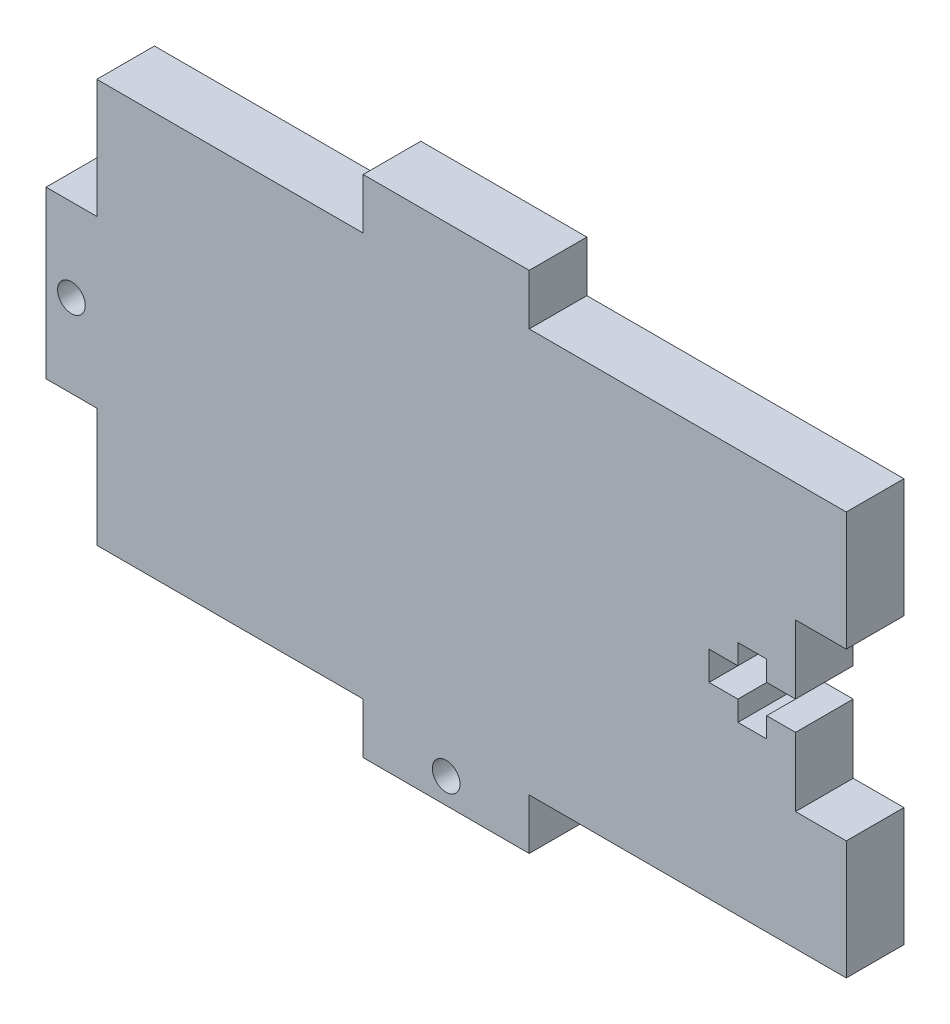
ISO-10303-21;
HEADER;
FILE_DESCRIPTION(('STEP AP214'),'2;1');
FILE_NAME('part.step','',(''),(''),'','','');
FILE_SCHEMA(('AUTOMOTIVE_DESIGN { 1 0 10303 214 1 1 1 1 }'));
ENDSEC;
DATA;
#1=APPLICATION_CONTEXT('core data for automotive mechanical design processes');
#2=APPLICATION_PROTOCOL_DEFINITION('international standard','automotive_design',2000,#1);
#3=PRODUCT_CONTEXT('',#1,'mechanical');
#4=PRODUCT('Part','Part','',(#3));
#5=PRODUCT_RELATED_PRODUCT_CATEGORY('part','',(#4));
#6=PRODUCT_DEFINITION_FORMATION('','',#4);
#7=PRODUCT_DEFINITION_CONTEXT('part definition',#1,'design');
#8=PRODUCT_DEFINITION('design','',#6,#7);
#9=PRODUCT_DEFINITION_SHAPE('','',#8);
#10=(LENGTH_UNIT() NAMED_UNIT(*) SI_UNIT(.MILLI.,.METRE.));
#11=(NAMED_UNIT(*) PLANE_ANGLE_UNIT() SI_UNIT($,.RADIAN.));
#12=(NAMED_UNIT(*) SI_UNIT($,.STERADIAN.) SOLID_ANGLE_UNIT());
#13=UNCERTAINTY_MEASURE_WITH_UNIT(LENGTH_MEASURE(1.E-05),#10,'distance_accuracy_value','');
#14=(GEOMETRIC_REPRESENTATION_CONTEXT(3) GLOBAL_UNCERTAINTY_ASSIGNED_CONTEXT((#13)) GLOBAL_UNIT_ASSIGNED_CONTEXT((#10,
#11,#12)) REPRESENTATION_CONTEXT('',''));
#15=CARTESIAN_POINT('',(0.,0.,0.));
#16=DIRECTION('',(0.,0.,1.));
#17=DIRECTION('',(1.,0.,0.));
#18=AXIS2_PLACEMENT_3D('',#15,#16,#17);
#19=CARTESIAN_POINT('',(76.962,13.081,-4.99999999997031E-05));
#20=DIRECTION('',(-1.,0.,0.));
#21=DIRECTION('',(0.,0.,1.));
#22=AXIS2_PLACEMENT_3D('',#19,#20,#21);
#23=PLANE('',#22);
#24=DIRECTION('',(0.,1.,0.));
#25=VECTOR('',#24,1.);
#26=CARTESIAN_POINT('',(76.962,0.,0.));
#27=LINE('',#26,#25);
#28=CARTESIAN_POINT('',(76.962,13.081,0.));
#29=VERTEX_POINT('',#28);
#30=CARTESIAN_POINT('',(76.962,20.6375,0.));
#31=VERTEX_POINT('',#30);
#32=EDGE_CURVE('E263',#29,#31,#27,.T.);
#33=ORIENTED_EDGE('',*,*,#32,.T.);
#34=DIRECTION('',(0.,0.,1.));
#35=VECTOR('',#34,1.);
#36=CARTESIAN_POINT('',(76.962,20.6375,-4.99999999997031E-05));
#37=LINE('',#36,#35);
#38=CARTESIAN_POINT('',(76.962,20.6375,6.35));
#39=VERTEX_POINT('',#38);
#40=EDGE_CURVE('E246',#31,#39,#37,.T.);
#41=ORIENTED_EDGE('',*,*,#40,.T.);
#42=DIRECTION('',(0.,-1.,0.));
#43=VECTOR('',#42,1.);
#44=CARTESIAN_POINT('',(76.962,13.081,6.35));
#45=LINE('',#44,#43);
#46=CARTESIAN_POINT('',(76.962,13.081,6.35));
#47=VERTEX_POINT('',#46);
#48=EDGE_CURVE('E260',#39,#47,#45,.T.);
#49=ORIENTED_EDGE('',*,*,#48,.T.);
#50=DIRECTION('',(0.,0.,1.));
#51=VECTOR('',#50,1.);
#52=CARTESIAN_POINT('',(76.962,13.081,-4.99999999997031E-05));
#53=LINE('',#52,#51);
#54=EDGE_CURVE('E286',#29,#47,#53,.T.);
#55=ORIENTED_EDGE('',*,*,#54,.F.);
#56=EDGE_LOOP('',(#33,#41,#49,#55));
#57=FACE_BOUND('',#56,.T.);
#58=ADVANCED_FACE('F33',(#57),#23,.F.);
#59=CARTESIAN_POINT('',(82.55,0.,6.35));
#60=DIRECTION('',(-1.,0.,0.));
#61=DIRECTION('',(0.,-1.,0.));
#62=AXIS2_PLACEMENT_3D('',#59,#60,#61);
#63=PLANE('',#62);
#64=DIRECTION('',(0.,1.,0.));
#65=VECTOR('',#64,1.);
#66=CARTESIAN_POINT('',(82.55,0.,0.));
#67=LINE('',#66,#65);
#68=CARTESIAN_POINT('',(82.55,0.,0.));
#69=VERTEX_POINT('',#68);
#70=CARTESIAN_POINT('',(82.55,13.081,0.));
#71=VERTEX_POINT('',#70);
#72=EDGE_CURVE('E487',#69,#71,#67,.T.);
#73=ORIENTED_EDGE('',*,*,#72,.T.);
#74=DIRECTION('',(0.,0.,1.));
#75=VECTOR('',#74,1.);
#76=CARTESIAN_POINT('',(82.55,13.081,-4.99999999997031E-05));
#77=LINE('',#76,#75);
#78=CARTESIAN_POINT('',(82.55,13.081,6.35));
#79=VERTEX_POINT('',#78);
#80=EDGE_CURVE('E282',#71,#79,#77,.T.);
#81=ORIENTED_EDGE('',*,*,#80,.T.);
#82=DIRECTION('',(0.,1.,0.));
#83=VECTOR('',#82,1.);
#84=CARTESIAN_POINT('',(82.55,0.,6.35));
#85=LINE('',#84,#83);
#86=CARTESIAN_POINT('',(82.55,0.,6.35));
#87=VERTEX_POINT('',#86);
#88=EDGE_CURVE('E461',#87,#79,#85,.T.);
#89=ORIENTED_EDGE('',*,*,#88,.F.);
#90=DIRECTION('',(0.,0.,-1.));
#91=VECTOR('',#90,1.);
#92=CARTESIAN_POINT('',(82.55,0.,6.35));
#93=LINE('',#92,#91);
#94=EDGE_CURVE('E496',#87,#69,#93,.T.);
#95=ORIENTED_EDGE('',*,*,#94,.T.);
#96=EDGE_LOOP('',(#73,#81,#89,#95));
#97=FACE_BOUND('',#96,.T.);
#98=ADVANCED_FACE('F676',(#97),#63,.F.);
#99=CARTESIAN_POINT('',(0.,0.,6.35));
#100=DIRECTION('',(0.,1.,0.));
#101=DIRECTION('',(0.,0.,1.));
#102=AXIS2_PLACEMENT_3D('',#99,#100,#101);
#103=PLANE('',#102);
#104=DIRECTION('',(0.,0.,1.));
#105=VECTOR('',#104,1.);
#106=CARTESIAN_POINT('',(47.625,0.,0.));
#107=LINE('',#106,#105);
#108=CARTESIAN_POINT('',(47.625,0.,0.));
#109=VERTEX_POINT('',#108);
#110=CARTESIAN_POINT('',(47.625,0.,6.35));
#111=VERTEX_POINT('',#110);
#112=EDGE_CURVE('E305',#109,#111,#107,.T.);
#113=ORIENTED_EDGE('',*,*,#112,.F.);
#114=DIRECTION('',(1.,0.,0.));
#115=VECTOR('',#114,1.);
#116=CARTESIAN_POINT('',(0.,0.,0.));
#117=LINE('',#116,#115);
#118=EDGE_CURVE('E504',#109,#69,#117,.T.);
#119=ORIENTED_EDGE('',*,*,#118,.T.);
#120=ORIENTED_EDGE('',*,*,#94,.F.);
#121=DIRECTION('',(1.,0.,0.));
#122=VECTOR('',#121,1.);
#123=CARTESIAN_POINT('',(0.,0.,6.35));
#124=LINE('',#123,#122);
#125=EDGE_CURVE('E466',#111,#87,#124,.T.);
#126=ORIENTED_EDGE('',*,*,#125,.F.);
#127=EDGE_LOOP('',(#113,#119,#120,#126));
#128=FACE_BOUND('',#127,.T.);
#129=ADVANCED_FACE('F657',(#128),#103,.F.);
#130=CARTESIAN_POINT('',(0.,44.45,6.35));
#131=DIRECTION('',(0.,-1.,0.));
#132=DIRECTION('',(0.,0.,-1.));
#133=AXIS2_PLACEMENT_3D('',#130,#131,#132);
#134=PLANE('',#133);
#135=DIRECTION('',(0.,0.,1.));
#136=VECTOR('',#135,1.);
#137=CARTESIAN_POINT('',(29.337,44.45,0.));
#138=LINE('',#137,#136);
#139=CARTESIAN_POINT('',(29.337,44.45,0.));
#140=VERTEX_POINT('',#139);
#141=CARTESIAN_POINT('',(29.337,44.45,6.35));
#142=VERTEX_POINT('',#141);
#143=EDGE_CURVE('E576',#140,#142,#138,.T.);
#144=ORIENTED_EDGE('',*,*,#143,.F.);
#145=DIRECTION('',(-1.,0.,0.));
#146=VECTOR('',#145,1.);
#147=CARTESIAN_POINT('',(0.,44.45,0.));
#148=LINE('',#147,#146);
#149=CARTESIAN_POINT('',(0.,44.45,0.));
#150=VERTEX_POINT('',#149);
#151=EDGE_CURVE('E483',#140,#150,#148,.T.);
#152=ORIENTED_EDGE('',*,*,#151,.T.);
#153=DIRECTION('',(0.,0.,-1.));
#154=VECTOR('',#153,1.);
#155=CARTESIAN_POINT('',(0.,44.45,6.35));
#156=LINE('',#155,#154);
#157=CARTESIAN_POINT('',(0.,44.45,6.35));
#158=VERTEX_POINT('',#157);
#159=EDGE_CURVE('E482',#158,#150,#156,.T.);
#160=ORIENTED_EDGE('',*,*,#159,.F.);
#161=DIRECTION('',(-1.,0.,0.));
#162=VECTOR('',#161,1.);
#163=CARTESIAN_POINT('',(0.,44.45,6.35));
#164=LINE('',#163,#162);
#165=EDGE_CURVE('E464',#142,#158,#164,.T.);
#166=ORIENTED_EDGE('',*,*,#165,.F.);
#167=EDGE_LOOP('',(#144,#152,#160,#166));
#168=FACE_BOUND('',#167,.T.);
#169=ADVANCED_FACE('F623',(#168),#134,.F.);
#170=CARTESIAN_POINT('',(0.,0.,6.35));
#171=DIRECTION('',(1.,0.,0.));
#172=DIRECTION('',(0.,1.,0.));
#173=AXIS2_PLACEMENT_3D('',#170,#171,#172);
#174=PLANE('',#173);
#175=DIRECTION('',(0.,0.,1.));
#176=VECTOR('',#175,1.);
#177=CARTESIAN_POINT('',(0.,13.081,0.));
#178=LINE('',#177,#176);
#179=CARTESIAN_POINT('',(0.,13.081,0.));
#180=VERTEX_POINT('',#179);
#181=CARTESIAN_POINT('',(0.,13.081,6.35));
#182=VERTEX_POINT('',#181);
#183=EDGE_CURVE('E507',#180,#182,#178,.T.);
#184=ORIENTED_EDGE('',*,*,#183,.F.);
#185=DIRECTION('',(0.,-1.,0.));
#186=VECTOR('',#185,1.);
#187=CARTESIAN_POINT('',(0.,0.,0.));
#188=LINE('',#187,#186);
#189=CARTESIAN_POINT('',(0.,0.,0.));
#190=VERTEX_POINT('',#189);
#191=EDGE_CURVE('E505',#180,#190,#188,.T.);
#192=ORIENTED_EDGE('',*,*,#191,.T.);
#193=DIRECTION('',(0.,0.,-1.));
#194=VECTOR('',#193,1.);
#195=CARTESIAN_POINT('',(0.,0.,6.35));
#196=LINE('',#195,#194);
#197=CARTESIAN_POINT('',(0.,0.,6.35));
#198=VERTEX_POINT('',#197);
#199=EDGE_CURVE('E321',#198,#190,#196,.T.);
#200=ORIENTED_EDGE('',*,*,#199,.F.);
#201=DIRECTION('',(0.,-1.,0.));
#202=VECTOR('',#201,1.);
#203=CARTESIAN_POINT('',(0.,0.,6.35));
#204=LINE('',#203,#202);
#205=EDGE_CURVE('E511',#182,#198,#204,.T.);
#206=ORIENTED_EDGE('',*,*,#205,.F.);
#207=EDGE_LOOP('',(#184,#192,#200,#206));
#208=FACE_BOUND('',#207,.T.);
#209=ADVANCED_FACE('F638',(#208),#174,.F.);
#210=CARTESIAN_POINT('',(0.,31.369,0.));
#211=VERTEX_POINT('',#210);
#212=EDGE_CURVE('E501',#150,#211,#188,.T.);
#213=ORIENTED_EDGE('',*,*,#212,.T.);
#214=DIRECTION('',(0.,0.,1.));
#215=VECTOR('',#214,1.);
#216=CARTESIAN_POINT('',(0.,31.369,0.));
#217=LINE('',#216,#215);
#218=CARTESIAN_POINT('',(0.,31.369,6.35));
#219=VERTEX_POINT('',#218);
#220=EDGE_CURVE('E521',#211,#219,#217,.T.);
#221=ORIENTED_EDGE('',*,*,#220,.T.);
#222=EDGE_CURVE('E508',#158,#219,#204,.T.);
#223=ORIENTED_EDGE('',*,*,#222,.F.);
#224=ORIENTED_EDGE('',*,*,#159,.T.);
#225=EDGE_LOOP('',(#213,#221,#223,#224));
#226=FACE_BOUND('',#225,.T.);
#227=ADVANCED_FACE('F35',(#226),#174,.F.);
#228=CARTESIAN_POINT('',(29.3369999999999,0.,0.));
#229=VERTEX_POINT('',#228);
#230=EDGE_CURVE('E594',#190,#229,#117,.T.);
#231=ORIENTED_EDGE('',*,*,#230,.T.);
#232=DIRECTION('',(0.,0.,1.));
#233=VECTOR('',#232,1.);
#234=CARTESIAN_POINT('',(29.3369999999999,0.,0.));
#235=LINE('',#234,#233);
#236=CARTESIAN_POINT('',(29.3369999999999,0.,6.35));
#237=VERTEX_POINT('',#236);
#238=EDGE_CURVE('E312',#229,#237,#235,.T.);
#239=ORIENTED_EDGE('',*,*,#238,.T.);
#240=EDGE_CURVE('E462',#198,#237,#124,.T.);
#241=ORIENTED_EDGE('',*,*,#240,.F.);
#242=ORIENTED_EDGE('',*,*,#199,.T.);
#243=EDGE_LOOP('',(#231,#239,#241,#242));
#244=FACE_BOUND('',#243,.T.);
#245=ADVANCED_FACE('F637',(#244),#103,.F.);
#246=CARTESIAN_POINT('',(82.55,31.369,6.35));
#247=VERTEX_POINT('',#246);
#248=CARTESIAN_POINT('',(82.55,44.45,6.35));
#249=VERTEX_POINT('',#248);
#250=EDGE_CURVE('E453',#247,#249,#85,.T.);
#251=ORIENTED_EDGE('',*,*,#250,.F.);
#252=DIRECTION('',(0.,0.,1.));
#253=VECTOR('',#252,1.);
#254=CARTESIAN_POINT('',(82.55,31.369,-4.99999999997031E-05));
#255=LINE('',#254,#253);
#256=CARTESIAN_POINT('',(82.55,31.369,0.));
#257=VERTEX_POINT('',#256);
#258=EDGE_CURVE('E281',#257,#247,#255,.T.);
#259=ORIENTED_EDGE('',*,*,#258,.F.);
#260=CARTESIAN_POINT('',(82.55,44.45,0.));
#261=VERTEX_POINT('',#260);
#262=EDGE_CURVE('E597',#257,#261,#67,.T.);
#263=ORIENTED_EDGE('',*,*,#262,.T.);
#264=DIRECTION('',(0.,0.,-1.));
#265=VECTOR('',#264,1.);
#266=CARTESIAN_POINT('',(82.55,44.45,6.35));
#267=LINE('',#266,#265);
#268=EDGE_CURVE('E459',#249,#261,#267,.T.);
#269=ORIENTED_EDGE('',*,*,#268,.F.);
#270=EDGE_LOOP('',(#251,#259,#263,#269));
#271=FACE_BOUND('',#270,.T.);
#272=ADVANCED_FACE('F456',(#271),#63,.F.);
#273=CARTESIAN_POINT('',(47.625,44.45,0.));
#274=VERTEX_POINT('',#273);
#275=EDGE_CURVE('E486',#261,#274,#148,.T.);
#276=ORIENTED_EDGE('',*,*,#275,.T.);
#277=DIRECTION('',(0.,0.,1.));
#278=VECTOR('',#277,1.);
#279=CARTESIAN_POINT('',(47.625,44.45,0.));
#280=LINE('',#279,#278);
#281=CARTESIAN_POINT('',(47.625,44.45,6.35));
#282=VERTEX_POINT('',#281);
#283=EDGE_CURVE('E563',#274,#282,#280,.T.);
#284=ORIENTED_EDGE('',*,*,#283,.T.);
#285=EDGE_CURVE('E480',#249,#282,#164,.T.);
#286=ORIENTED_EDGE('',*,*,#285,.F.);
#287=ORIENTED_EDGE('',*,*,#268,.T.);
#288=EDGE_LOOP('',(#276,#284,#286,#287));
#289=FACE_BOUND('',#288,.T.);
#290=ADVANCED_FACE('F630',(#289),#134,.F.);
#291=CARTESIAN_POINT('',(0.,0.,6.35));
#292=DIRECTION('',(0.,0.,-1.));
#293=DIRECTION('',(-1.,0.,0.));
#294=AXIS2_PLACEMENT_3D('',#291,#292,#293);
#295=PLANE('',#294);
#296=CARTESIAN_POINT('',(38.481,-2.79399999999999,6.35));
#297=DIRECTION('',(0.,0.,1.));
#298=DIRECTION('',(1.,0.,0.));
#299=AXIS2_PLACEMENT_3D('',#296,#297,#298);
#300=CIRCLE('',#299,1.524);
#301=CARTESIAN_POINT('',(40.005,-2.79399999999999,6.35));
#302=VERTEX_POINT('',#301);
#303=EDGE_CURVE('E348',#302,#302,#300,.T.);
#304=ORIENTED_EDGE('',*,*,#303,.F.);
#305=EDGE_LOOP('',(#304));
#306=FACE_BOUND('',#305,.T.);
#307=CARTESIAN_POINT('',(-2.794,22.225,6.35));
#308=DIRECTION('',(0.,0.,1.));
#309=DIRECTION('',(1.,0.,0.));
#310=AXIS2_PLACEMENT_3D('',#307,#308,#309);
#311=CIRCLE('',#310,1.524);
#312=CARTESIAN_POINT('',(-1.27,22.225,6.35));
#313=VERTEX_POINT('',#312);
#314=EDGE_CURVE('E340',#313,#313,#311,.T.);
#315=ORIENTED_EDGE('',*,*,#314,.F.);
#316=EDGE_LOOP('',(#315));
#317=FACE_BOUND('',#316,.T.);
#318=ORIENTED_EDGE('',*,*,#48,.F.);
#319=DIRECTION('',(1.,0.,0.));
#320=VECTOR('',#319,1.);
#321=CARTESIAN_POINT('',(73.787,20.6375,6.35));
#322=LINE('',#321,#320);
#323=CARTESIAN_POINT('',(73.787,20.6375,6.35));
#324=VERTEX_POINT('',#323);
#325=EDGE_CURVE('E243',#324,#39,#322,.T.);
#326=ORIENTED_EDGE('',*,*,#325,.F.);
#327=DIRECTION('',(0.,1.,0.));
#328=VECTOR('',#327,1.);
#329=CARTESIAN_POINT('',(73.787,18.415,6.35));
#330=LINE('',#329,#328);
#331=CARTESIAN_POINT('',(73.787,18.415,6.35));
#332=VERTEX_POINT('',#331);
#333=EDGE_CURVE('E377',#332,#324,#330,.T.);
#334=ORIENTED_EDGE('',*,*,#333,.F.);
#335=DIRECTION('',(1.,0.,0.));
#336=VECTOR('',#335,1.);
#337=CARTESIAN_POINT('',(70.612,18.415,6.35));
#338=LINE('',#337,#336);
#339=CARTESIAN_POINT('',(70.612,18.415,6.35));
#340=VERTEX_POINT('',#339);
#341=EDGE_CURVE('E374',#340,#332,#338,.T.);
#342=ORIENTED_EDGE('',*,*,#341,.F.);
#343=DIRECTION('',(0.,-1.,0.));
#344=VECTOR('',#343,1.);
#345=CARTESIAN_POINT('',(70.612,18.415,6.35));
#346=LINE('',#345,#344);
#347=CARTESIAN_POINT('',(70.612,20.6375,6.35));
#348=VERTEX_POINT('',#347);
#349=EDGE_CURVE('E371',#348,#340,#346,.T.);
#350=ORIENTED_EDGE('',*,*,#349,.F.);
#351=DIRECTION('',(1.,0.,0.));
#352=VECTOR('',#351,1.);
#353=CARTESIAN_POINT('',(67.437,20.6375,6.35));
#354=LINE('',#353,#352);
#355=CARTESIAN_POINT('',(67.437,20.6375,6.35));
#356=VERTEX_POINT('',#355);
#357=EDGE_CURVE('E368',#356,#348,#354,.T.);
#358=ORIENTED_EDGE('',*,*,#357,.F.);
#359=DIRECTION('',(0.,-1.,0.));
#360=VECTOR('',#359,1.);
#361=CARTESIAN_POINT('',(67.437,23.8125,6.35));
#362=LINE('',#361,#360);
#363=CARTESIAN_POINT('',(67.437,23.8125,6.35));
#364=VERTEX_POINT('',#363);
#365=EDGE_CURVE('E365',#364,#356,#362,.T.);
#366=ORIENTED_EDGE('',*,*,#365,.F.);
#367=DIRECTION('',(-1.,0.,0.));
#368=VECTOR('',#367,1.);
#369=CARTESIAN_POINT('',(67.437,23.8125,6.35));
#370=LINE('',#369,#368);
#371=CARTESIAN_POINT('',(70.612,23.8125,6.35));
#372=VERTEX_POINT('',#371);
#373=EDGE_CURVE('E362',#372,#364,#370,.T.);
#374=ORIENTED_EDGE('',*,*,#373,.F.);
#375=DIRECTION('',(0.,-1.,0.));
#376=VECTOR('',#375,1.);
#377=CARTESIAN_POINT('',(70.612,23.8125,6.35));
#378=LINE('',#377,#376);
#379=CARTESIAN_POINT('',(70.612,26.035,6.35));
#380=VERTEX_POINT('',#379);
#381=EDGE_CURVE('E359',#380,#372,#378,.T.);
#382=ORIENTED_EDGE('',*,*,#381,.F.);
#383=DIRECTION('',(-1.,0.,0.));
#384=VECTOR('',#383,1.);
#385=CARTESIAN_POINT('',(70.612,26.035,6.35));
#386=LINE('',#385,#384);
#387=CARTESIAN_POINT('',(73.787,26.035,6.35));
#388=VERTEX_POINT('',#387);
#389=EDGE_CURVE('E356',#388,#380,#386,.T.);
#390=ORIENTED_EDGE('',*,*,#389,.F.);
#391=DIRECTION('',(0.,1.,0.));
#392=VECTOR('',#391,1.);
#393=CARTESIAN_POINT('',(73.787,23.8125,6.35));
#394=LINE('',#393,#392);
#395=CARTESIAN_POINT('',(73.787,23.8125,6.35));
#396=VERTEX_POINT('',#395);
#397=EDGE_CURVE('E353',#396,#388,#394,.T.);
#398=ORIENTED_EDGE('',*,*,#397,.F.);
#399=DIRECTION('',(-1.,0.,0.));
#400=VECTOR('',#399,1.);
#401=CARTESIAN_POINT('',(73.787,23.8125,6.35));
#402=LINE('',#401,#400);
#403=CARTESIAN_POINT('',(76.962,23.8125,6.35));
#404=VERTEX_POINT('',#403);
#405=EDGE_CURVE('E254',#404,#396,#402,.T.);
#406=ORIENTED_EDGE('',*,*,#405,.F.);
#407=CARTESIAN_POINT('',(76.962,31.369,6.35));
#408=VERTEX_POINT('',#407);
#409=EDGE_CURVE('E271',#408,#404,#45,.T.);
#410=ORIENTED_EDGE('',*,*,#409,.F.);
#411=DIRECTION('',(-1.,0.,0.));
#412=VECTOR('',#411,1.);
#413=CARTESIAN_POINT('',(82.55,31.369,6.35));
#414=LINE('',#413,#412);
#415=EDGE_CURVE('E272',#247,#408,#414,.T.);
#416=ORIENTED_EDGE('',*,*,#415,.F.);
#417=ORIENTED_EDGE('',*,*,#250,.T.);
#418=ORIENTED_EDGE('',*,*,#285,.T.);
#419=DIRECTION('',(0.,1.,0.));
#420=VECTOR('',#419,1.);
#421=CARTESIAN_POINT('',(47.625,44.45,6.35));
#422=LINE('',#421,#420);
#423=CARTESIAN_POINT('',(47.625,50.038,6.35));
#424=VERTEX_POINT('',#423);
#425=EDGE_CURVE('E591',#282,#424,#422,.T.);
#426=ORIENTED_EDGE('',*,*,#425,.T.);
#427=DIRECTION('',(-1.,0.,0.));
#428=VECTOR('',#427,1.);
#429=CARTESIAN_POINT('',(29.337,50.038,6.35));
#430=LINE('',#429,#428);
#431=CARTESIAN_POINT('',(29.337,50.038,6.35));
#432=VERTEX_POINT('',#431);
#433=EDGE_CURVE('E566',#424,#432,#430,.T.);
#434=ORIENTED_EDGE('',*,*,#433,.T.);
#435=DIRECTION('',(0.,-1.,0.));
#436=VECTOR('',#435,1.);
#437=CARTESIAN_POINT('',(29.337,44.45,6.35));
#438=LINE('',#437,#436);
#439=EDGE_CURVE('E308',#432,#142,#438,.T.);
#440=ORIENTED_EDGE('',*,*,#439,.T.);
#441=ORIENTED_EDGE('',*,*,#165,.T.);
#442=ORIENTED_EDGE('',*,*,#222,.T.);
#443=DIRECTION('',(-1.,0.,0.));
#444=VECTOR('',#443,1.);
#445=CARTESIAN_POINT('',(0.,31.369,6.35));
#446=LINE('',#445,#444);
#447=CARTESIAN_POINT('',(-5.588,31.369,6.35));
#448=VERTEX_POINT('',#447);
#449=EDGE_CURVE('E549',#219,#448,#446,.T.);
#450=ORIENTED_EDGE('',*,*,#449,.T.);
#451=DIRECTION('',(0.,-1.,0.));
#452=VECTOR('',#451,1.);
#453=CARTESIAN_POINT('',(-5.588,31.369,6.35));
#454=LINE('',#453,#452);
#455=CARTESIAN_POINT('',(-5.588,13.081,6.35));
#456=VERTEX_POINT('',#455);
#457=EDGE_CURVE('E540',#448,#456,#454,.T.);
#458=ORIENTED_EDGE('',*,*,#457,.T.);
#459=DIRECTION('',(1.,0.,0.));
#460=VECTOR('',#459,1.);
#461=CARTESIAN_POINT('',(0.,13.081,6.35));
#462=LINE('',#461,#460);
#463=EDGE_CURVE('E531',#456,#182,#462,.T.);
#464=ORIENTED_EDGE('',*,*,#463,.T.);
#465=ORIENTED_EDGE('',*,*,#205,.T.);
#466=ORIENTED_EDGE('',*,*,#240,.T.);
#467=DIRECTION('',(0.,-1.,0.));
#468=VECTOR('',#467,1.);
#469=CARTESIAN_POINT('',(29.3369999999999,0.,6.35));
#470=LINE('',#469,#468);
#471=CARTESIAN_POINT('',(29.337,-5.588,6.35));
#472=VERTEX_POINT('',#471);
#473=EDGE_CURVE('E285',#237,#472,#470,.T.);
#474=ORIENTED_EDGE('',*,*,#473,.T.);
#475=DIRECTION('',(1.,0.,0.));
#476=VECTOR('',#475,1.);
#477=CARTESIAN_POINT('',(29.337,-5.588,6.35));
#478=LINE('',#477,#476);
#479=CARTESIAN_POINT('',(47.6249999999999,-5.588,6.35));
#480=VERTEX_POINT('',#479);
#481=EDGE_CURVE('E296',#472,#480,#478,.T.);
#482=ORIENTED_EDGE('',*,*,#481,.T.);
#483=DIRECTION('',(0.,1.,0.));
#484=VECTOR('',#483,1.);
#485=CARTESIAN_POINT('',(47.625,0.,6.35));
#486=LINE('',#485,#484);
#487=EDGE_CURVE('E299',#480,#111,#486,.T.);
#488=ORIENTED_EDGE('',*,*,#487,.T.);
#489=ORIENTED_EDGE('',*,*,#125,.T.);
#490=ORIENTED_EDGE('',*,*,#88,.T.);
#491=DIRECTION('',(1.,0.,0.));
#492=VECTOR('',#491,1.);
#493=CARTESIAN_POINT('',(82.55,13.081,6.35));
#494=LINE('',#493,#492);
#495=EDGE_CURVE('E270',#47,#79,#494,.T.);
#496=ORIENTED_EDGE('',*,*,#495,.F.);
#497=EDGE_LOOP('',(#318,#326,#334,#342,#350,#358,#366,#374,#382,#390,#398,#406,#410,#416,#417,
#418,#426,#434,#440,#441,#442,#450,#458,#464,#465,#466,#474,#482,#488,#489,#490,#496));
#498=FACE_BOUND('',#497,.T.);
#499=ADVANCED_FACE('F268',(#306,#317,#498),#295,.F.);
#500=CARTESIAN_POINT('',(0.,0.,0.));
#501=DIRECTION('',(0.,0.,-1.));
#502=DIRECTION('',(-1.,0.,0.));
#503=AXIS2_PLACEMENT_3D('',#500,#501,#502);
#504=PLANE('',#503);
#505=CARTESIAN_POINT('',(38.481,-2.79399999999999,0.));
#506=DIRECTION('',(0.,0.,-1.));
#507=DIRECTION('',(-1.,0.,0.));
#508=AXIS2_PLACEMENT_3D('',#505,#506,#507);
#509=CIRCLE('',#508,1.524);
#510=CARTESIAN_POINT('',(36.957,-2.79399999999999,0.));
#511=VERTEX_POINT('',#510);
#512=EDGE_CURVE('E37',#511,#511,#509,.T.);
#513=ORIENTED_EDGE('',*,*,#512,.F.);
#514=EDGE_LOOP('',(#513));
#515=FACE_BOUND('',#514,.T.);
#516=CARTESIAN_POINT('',(-2.794,22.225,0.));
#517=DIRECTION('',(0.,0.,-1.));
#518=DIRECTION('',(-1.,0.,0.));
#519=AXIS2_PLACEMENT_3D('',#516,#517,#518);
#520=CIRCLE('',#519,1.524);
#521=CARTESIAN_POINT('',(-4.318,22.225,0.));
#522=VERTEX_POINT('',#521);
#523=EDGE_CURVE('E255',#522,#522,#520,.T.);
#524=ORIENTED_EDGE('',*,*,#523,.F.);
#525=EDGE_LOOP('',(#524));
#526=FACE_BOUND('',#525,.T.);
#527=DIRECTION('',(-1.,0.,0.));
#528=VECTOR('',#527,1.);
#529=CARTESIAN_POINT('',(0.,20.6375,0.));
#530=LINE('',#529,#528);
#531=CARTESIAN_POINT('',(73.787,20.6375,0.));
#532=VERTEX_POINT('',#531);
#533=EDGE_CURVE('E276',#31,#532,#530,.T.);
#534=ORIENTED_EDGE('',*,*,#533,.F.);
#535=ORIENTED_EDGE('',*,*,#32,.F.);
#536=DIRECTION('',(-1.,0.,0.));
#537=VECTOR('',#536,1.);
#538=CARTESIAN_POINT('',(0.,13.081,0.));
#539=LINE('',#538,#537);
#540=EDGE_CURVE('E323',#71,#29,#539,.T.);
#541=ORIENTED_EDGE('',*,*,#540,.F.);
#542=ORIENTED_EDGE('',*,*,#72,.F.);
#543=ORIENTED_EDGE('',*,*,#118,.F.);
#544=DIRECTION('',(0.,1.,0.));
#545=VECTOR('',#544,1.);
#546=CARTESIAN_POINT('',(47.625,0.,0.));
#547=LINE('',#546,#545);
#548=CARTESIAN_POINT('',(47.6249999999999,-5.588,0.));
#549=VERTEX_POINT('',#548);
#550=EDGE_CURVE('E294',#549,#109,#547,.T.);
#551=ORIENTED_EDGE('',*,*,#550,.F.);
#552=DIRECTION('',(1.,0.,0.));
#553=VECTOR('',#552,1.);
#554=CARTESIAN_POINT('',(29.337,-5.588,0.));
#555=LINE('',#554,#553);
#556=CARTESIAN_POINT('',(29.337,-5.588,0.));
#557=VERTEX_POINT('',#556);
#558=EDGE_CURVE('E291',#557,#549,#555,.T.);
#559=ORIENTED_EDGE('',*,*,#558,.F.);
#560=DIRECTION('',(0.,-1.,0.));
#561=VECTOR('',#560,1.);
#562=CARTESIAN_POINT('',(29.3369999999999,0.,0.));
#563=LINE('',#562,#561);
#564=EDGE_CURVE('E295',#229,#557,#563,.T.);
#565=ORIENTED_EDGE('',*,*,#564,.F.);
#566=ORIENTED_EDGE('',*,*,#230,.F.);
#567=ORIENTED_EDGE('',*,*,#191,.F.);
#568=DIRECTION('',(1.,0.,0.));
#569=VECTOR('',#568,1.);
#570=CARTESIAN_POINT('',(0.,13.081,0.));
#571=LINE('',#570,#569);
#572=CARTESIAN_POINT('',(-5.588,13.081,0.));
#573=VERTEX_POINT('',#572);
#574=EDGE_CURVE('E525',#573,#180,#571,.T.);
#575=ORIENTED_EDGE('',*,*,#574,.F.);
#576=DIRECTION('',(0.,-1.,0.));
#577=VECTOR('',#576,1.);
#578=CARTESIAN_POINT('',(-5.588,31.369,0.));
#579=LINE('',#578,#577);
#580=CARTESIAN_POINT('',(-5.588,31.369,0.));
#581=VERTEX_POINT('',#580);
#582=EDGE_CURVE('E530',#581,#573,#579,.T.);
#583=ORIENTED_EDGE('',*,*,#582,.F.);
#584=DIRECTION('',(-1.,0.,0.));
#585=VECTOR('',#584,1.);
#586=CARTESIAN_POINT('',(0.,31.369,0.));
#587=LINE('',#586,#585);
#588=EDGE_CURVE('E527',#211,#581,#587,.T.);
#589=ORIENTED_EDGE('',*,*,#588,.F.);
#590=ORIENTED_EDGE('',*,*,#212,.F.);
#591=ORIENTED_EDGE('',*,*,#151,.F.);
#592=DIRECTION('',(0.,-1.,0.));
#593=VECTOR('',#592,1.);
#594=CARTESIAN_POINT('',(29.337,44.45,0.));
#595=LINE('',#594,#593);
#596=CARTESIAN_POINT('',(29.337,50.038,0.));
#597=VERTEX_POINT('',#596);
#598=EDGE_CURVE('E582',#597,#140,#595,.T.);
#599=ORIENTED_EDGE('',*,*,#598,.F.);
#600=DIRECTION('',(-1.,0.,0.));
#601=VECTOR('',#600,1.);
#602=CARTESIAN_POINT('',(29.337,50.038,0.));
#603=LINE('',#602,#601);
#604=CARTESIAN_POINT('',(47.625,50.038,0.));
#605=VERTEX_POINT('',#604);
#606=EDGE_CURVE('E581',#605,#597,#603,.T.);
#607=ORIENTED_EDGE('',*,*,#606,.F.);
#608=DIRECTION('',(0.,1.,0.));
#609=VECTOR('',#608,1.);
#610=CARTESIAN_POINT('',(47.625,44.45,0.));
#611=LINE('',#610,#609);
#612=EDGE_CURVE('E578',#274,#605,#611,.T.);
#613=ORIENTED_EDGE('',*,*,#612,.F.);
#614=ORIENTED_EDGE('',*,*,#275,.F.);
#615=ORIENTED_EDGE('',*,*,#262,.F.);
#616=DIRECTION('',(1.,0.,0.));
#617=VECTOR('',#616,1.);
#618=CARTESIAN_POINT('',(0.,31.369,0.));
#619=LINE('',#618,#617);
#620=CARTESIAN_POINT('',(76.962,31.369,0.));
#621=VERTEX_POINT('',#620);
#622=EDGE_CURVE('E319',#621,#257,#619,.T.);
#623=ORIENTED_EDGE('',*,*,#622,.F.);
#624=CARTESIAN_POINT('',(76.962,23.8125,0.));
#625=VERTEX_POINT('',#624);
#626=EDGE_CURVE('E57',#625,#621,#27,.T.);
#627=ORIENTED_EDGE('',*,*,#626,.F.);
#628=DIRECTION('',(1.,0.,0.));
#629=VECTOR('',#628,1.);
#630=CARTESIAN_POINT('',(0.,23.8125,0.));
#631=LINE('',#630,#629);
#632=CARTESIAN_POINT('',(73.787,23.8125,0.));
#633=VERTEX_POINT('',#632);
#634=EDGE_CURVE('E50',#633,#625,#631,.T.);
#635=ORIENTED_EDGE('',*,*,#634,.F.);
#636=DIRECTION('',(0.,-1.,0.));
#637=VECTOR('',#636,1.);
#638=CARTESIAN_POINT('',(73.787,0.,0.));
#639=LINE('',#638,#637);
#640=CARTESIAN_POINT('',(73.787,26.035,0.));
#641=VERTEX_POINT('',#640);
#642=EDGE_CURVE('E264',#641,#633,#639,.T.);
#643=ORIENTED_EDGE('',*,*,#642,.F.);
#644=DIRECTION('',(1.,0.,0.));
#645=VECTOR('',#644,1.);
#646=CARTESIAN_POINT('',(0.,26.035,0.));
#647=LINE('',#646,#645);
#648=CARTESIAN_POINT('',(70.612,26.035,0.));
#649=VERTEX_POINT('',#648);
#650=EDGE_CURVE('E327',#649,#641,#647,.T.);
#651=ORIENTED_EDGE('',*,*,#650,.F.);
#652=DIRECTION('',(0.,1.,0.));
#653=VECTOR('',#652,1.);
#654=CARTESIAN_POINT('',(70.612,0.,0.));
#655=LINE('',#654,#653);
#656=CARTESIAN_POINT('',(70.612,23.8125,0.));
#657=VERTEX_POINT('',#656);
#658=EDGE_CURVE('E329',#657,#649,#655,.T.);
#659=ORIENTED_EDGE('',*,*,#658,.F.);
#660=DIRECTION('',(1.,0.,0.));
#661=VECTOR('',#660,1.);
#662=CARTESIAN_POINT('',(0.,23.8125,0.));
#663=LINE('',#662,#661);
#664=CARTESIAN_POINT('',(67.437,23.8125,0.));
#665=VERTEX_POINT('',#664);
#666=EDGE_CURVE('E331',#665,#657,#663,.T.);
#667=ORIENTED_EDGE('',*,*,#666,.F.);
#668=DIRECTION('',(0.,1.,0.));
#669=VECTOR('',#668,1.);
#670=CARTESIAN_POINT('',(67.437,0.,0.));
#671=LINE('',#670,#669);
#672=CARTESIAN_POINT('',(67.437,20.6375,0.));
#673=VERTEX_POINT('',#672);
#674=EDGE_CURVE('E333',#673,#665,#671,.T.);
#675=ORIENTED_EDGE('',*,*,#674,.F.);
#676=DIRECTION('',(-1.,0.,0.));
#677=VECTOR('',#676,1.);
#678=CARTESIAN_POINT('',(0.,20.6375000000001,0.));
#679=LINE('',#678,#677);
#680=CARTESIAN_POINT('',(70.612,20.6375,0.));
#681=VERTEX_POINT('',#680);
#682=EDGE_CURVE('E335',#681,#673,#679,.T.);
#683=ORIENTED_EDGE('',*,*,#682,.F.);
#684=DIRECTION('',(0.,1.,0.));
#685=VECTOR('',#684,1.);
#686=CARTESIAN_POINT('',(70.612,0.,0.));
#687=LINE('',#686,#685);
#688=CARTESIAN_POINT('',(70.612,18.415,0.));
#689=VERTEX_POINT('',#688);
#690=EDGE_CURVE('E337',#689,#681,#687,.T.);
#691=ORIENTED_EDGE('',*,*,#690,.F.);
#692=DIRECTION('',(-1.,0.,0.));
#693=VECTOR('',#692,1.);
#694=CARTESIAN_POINT('',(0.,18.415,0.));
#695=LINE('',#694,#693);
#696=CARTESIAN_POINT('',(73.787,18.415,0.));
#697=VERTEX_POINT('',#696);
#698=EDGE_CURVE('E42',#697,#689,#695,.T.);
#699=ORIENTED_EDGE('',*,*,#698,.F.);
#700=DIRECTION('',(0.,-1.,0.));
#701=VECTOR('',#700,1.);
#702=CARTESIAN_POINT('',(73.787,0.,0.));
#703=LINE('',#702,#701);
#704=EDGE_CURVE('E11',#532,#697,#703,.T.);
#705=ORIENTED_EDGE('',*,*,#704,.F.);
#706=EDGE_LOOP('',(#534,#535,#541,#542,#543,#551,#559,#565,#566,#567,#575,#583,#589,#590,#591,
#599,#607,#613,#614,#615,#623,#627,#635,#643,#651,#659,#667,#675,#683,#691,#699,#705));
#707=FACE_BOUND('',#706,.T.);
#708=ADVANCED_FACE('F404',(#515,#526,#707),#504,.T.);
#709=CARTESIAN_POINT('',(0.,13.081,0.));
#710=DIRECTION('',(0.,-1.,0.));
#711=DIRECTION('',(0.,0.,-1.));
#712=AXIS2_PLACEMENT_3D('',#709,#710,#711);
#713=PLANE('',#712);
#714=ORIENTED_EDGE('',*,*,#463,.F.);
#715=DIRECTION('',(0.,0.,1.));
#716=VECTOR('',#715,1.);
#717=CARTESIAN_POINT('',(-5.588,13.081,0.));
#718=LINE('',#717,#716);
#719=EDGE_CURVE('E536',#573,#456,#718,.T.);
#720=ORIENTED_EDGE('',*,*,#719,.F.);
#721=ORIENTED_EDGE('',*,*,#574,.T.);
#722=ORIENTED_EDGE('',*,*,#183,.T.);
#723=EDGE_LOOP('',(#714,#720,#721,#722));
#724=FACE_BOUND('',#723,.T.);
#725=ADVANCED_FACE('F760',(#724),#713,.T.);
#726=CARTESIAN_POINT('',(-5.588,31.369,0.));
#727=DIRECTION('',(-1.,0.,0.));
#728=DIRECTION('',(0.,0.,1.));
#729=AXIS2_PLACEMENT_3D('',#726,#727,#728);
#730=PLANE('',#729);
#731=ORIENTED_EDGE('',*,*,#457,.F.);
#732=DIRECTION('',(0.,0.,1.));
#733=VECTOR('',#732,1.);
#734=CARTESIAN_POINT('',(-5.588,31.369,0.));
#735=LINE('',#734,#733);
#736=EDGE_CURVE('E518',#581,#448,#735,.T.);
#737=ORIENTED_EDGE('',*,*,#736,.F.);
#738=ORIENTED_EDGE('',*,*,#582,.T.);
#739=ORIENTED_EDGE('',*,*,#719,.T.);
#740=EDGE_LOOP('',(#731,#737,#738,#739));
#741=FACE_BOUND('',#740,.T.);
#742=ADVANCED_FACE('F552',(#741),#730,.T.);
#743=CARTESIAN_POINT('',(0.,31.369,0.));
#744=DIRECTION('',(0.,1.,0.));
#745=DIRECTION('',(-1.,0.,0.));
#746=AXIS2_PLACEMENT_3D('',#743,#744,#745);
#747=PLANE('',#746);
#748=ORIENTED_EDGE('',*,*,#449,.F.);
#749=ORIENTED_EDGE('',*,*,#220,.F.);
#750=ORIENTED_EDGE('',*,*,#588,.T.);
#751=ORIENTED_EDGE('',*,*,#736,.T.);
#752=EDGE_LOOP('',(#748,#749,#750,#751));
#753=FACE_BOUND('',#752,.T.);
#754=ADVANCED_FACE('F547',(#753),#747,.T.);
#755=CARTESIAN_POINT('',(29.337,44.45,0.));
#756=DIRECTION('',(-1.,0.,0.));
#757=DIRECTION('',(0.,-1.,0.));
#758=AXIS2_PLACEMENT_3D('',#755,#756,#757);
#759=PLANE('',#758);
#760=ORIENTED_EDGE('',*,*,#439,.F.);
#761=DIRECTION('',(0.,0.,1.));
#762=VECTOR('',#761,1.);
#763=CARTESIAN_POINT('',(29.337,50.038,0.));
#764=LINE('',#763,#762);
#765=EDGE_CURVE('E556',#597,#432,#764,.T.);
#766=ORIENTED_EDGE('',*,*,#765,.F.);
#767=ORIENTED_EDGE('',*,*,#598,.T.);
#768=ORIENTED_EDGE('',*,*,#143,.T.);
#769=EDGE_LOOP('',(#760,#766,#767,#768));
#770=FACE_BOUND('',#769,.T.);
#771=ADVANCED_FACE('F620',(#770),#759,.T.);
#772=CARTESIAN_POINT('',(29.337,50.038,0.));
#773=DIRECTION('',(0.,1.,0.));
#774=DIRECTION('',(0.,0.,1.));
#775=AXIS2_PLACEMENT_3D('',#772,#773,#774);
#776=PLANE('',#775);
#777=ORIENTED_EDGE('',*,*,#433,.F.);
#778=DIRECTION('',(0.,0.,1.));
#779=VECTOR('',#778,1.);
#780=CARTESIAN_POINT('',(47.625,50.038,0.));
#781=LINE('',#780,#779);
#782=EDGE_CURVE('E557',#605,#424,#781,.T.);
#783=ORIENTED_EDGE('',*,*,#782,.F.);
#784=ORIENTED_EDGE('',*,*,#606,.T.);
#785=ORIENTED_EDGE('',*,*,#765,.T.);
#786=EDGE_LOOP('',(#777,#783,#784,#785));
#787=FACE_BOUND('',#786,.T.);
#788=ADVANCED_FACE('F611',(#787),#776,.T.);
#789=CARTESIAN_POINT('',(47.625,44.45,0.));
#790=DIRECTION('',(1.,0.,0.));
#791=DIRECTION('',(0.,1.,0.));
#792=AXIS2_PLACEMENT_3D('',#789,#790,#791);
#793=PLANE('',#792);
#794=ORIENTED_EDGE('',*,*,#425,.F.);
#795=ORIENTED_EDGE('',*,*,#283,.F.);
#796=ORIENTED_EDGE('',*,*,#612,.T.);
#797=ORIENTED_EDGE('',*,*,#782,.T.);
#798=EDGE_LOOP('',(#794,#795,#796,#797));
#799=FACE_BOUND('',#798,.T.);
#800=ADVANCED_FACE('F628',(#799),#793,.T.);
#801=CARTESIAN_POINT('',(47.625,0.,0.));
#802=DIRECTION('',(1.,0.,0.));
#803=DIRECTION('',(0.,1.,0.));
#804=AXIS2_PLACEMENT_3D('',#801,#802,#803);
#805=PLANE('',#804);
#806=ORIENTED_EDGE('',*,*,#487,.F.);
#807=DIRECTION('',(0.,0.,1.));
#808=VECTOR('',#807,1.);
#809=CARTESIAN_POINT('',(47.6249999999999,-5.588,0.));
#810=LINE('',#809,#808);
#811=EDGE_CURVE('E302',#549,#480,#810,.T.);
#812=ORIENTED_EDGE('',*,*,#811,.F.);
#813=ORIENTED_EDGE('',*,*,#550,.T.);
#814=ORIENTED_EDGE('',*,*,#112,.T.);
#815=EDGE_LOOP('',(#806,#812,#813,#814));
#816=FACE_BOUND('',#815,.T.);
#817=ADVANCED_FACE('F653',(#816),#805,.T.);
#818=CARTESIAN_POINT('',(29.337,-5.588,0.));
#819=DIRECTION('',(0.,-1.,0.));
#820=DIRECTION('',(0.,0.,-1.));
#821=AXIS2_PLACEMENT_3D('',#818,#819,#820);
#822=PLANE('',#821);
#823=ORIENTED_EDGE('',*,*,#481,.F.);
#824=DIRECTION('',(0.,0.,1.));
#825=VECTOR('',#824,1.);
#826=CARTESIAN_POINT('',(29.337,-5.588,0.));
#827=LINE('',#826,#825);
#828=EDGE_CURVE('E608',#557,#472,#827,.T.);
#829=ORIENTED_EDGE('',*,*,#828,.F.);
#830=ORIENTED_EDGE('',*,*,#558,.T.);
#831=ORIENTED_EDGE('',*,*,#811,.T.);
#832=EDGE_LOOP('',(#823,#829,#830,#831));
#833=FACE_BOUND('',#832,.T.);
#834=ADVANCED_FACE('F694',(#833),#822,.T.);
#835=CARTESIAN_POINT('',(29.3369999999999,0.,0.));
#836=DIRECTION('',(-1.,0.,0.));
#837=DIRECTION('',(0.,-1.,0.));
#838=AXIS2_PLACEMENT_3D('',#835,#836,#837);
#839=PLANE('',#838);
#840=ORIENTED_EDGE('',*,*,#473,.F.);
#841=ORIENTED_EDGE('',*,*,#238,.F.);
#842=ORIENTED_EDGE('',*,*,#564,.T.);
#843=ORIENTED_EDGE('',*,*,#828,.T.);
#844=EDGE_LOOP('',(#840,#841,#842,#843));
#845=FACE_BOUND('',#844,.T.);
#846=ADVANCED_FACE('F647',(#845),#839,.T.);
#847=CARTESIAN_POINT('',(82.55,13.081,-4.99999999997031E-05));
#848=DIRECTION('',(0.,-1.,0.));
#849=DIRECTION('',(0.,0.,-1.));
#850=AXIS2_PLACEMENT_3D('',#847,#848,#849);
#851=PLANE('',#850);
#852=ORIENTED_EDGE('',*,*,#540,.T.);
#853=ORIENTED_EDGE('',*,*,#54,.T.);
#854=ORIENTED_EDGE('',*,*,#495,.T.);
#855=ORIENTED_EDGE('',*,*,#80,.F.);
#856=EDGE_LOOP('',(#852,#853,#854,#855));
#857=FACE_BOUND('',#856,.T.);
#858=ADVANCED_FACE('F685',(#857),#851,.F.);
#859=ORIENTED_EDGE('',*,*,#409,.T.);
#860=DIRECTION('',(0.,0.,-1.));
#861=VECTOR('',#860,1.);
#862=CARTESIAN_POINT('',(76.962,23.8125,-4.99999999997031E-05));
#863=LINE('',#862,#861);
#864=EDGE_CURVE('E265',#404,#625,#863,.T.);
#865=ORIENTED_EDGE('',*,*,#864,.T.);
#866=ORIENTED_EDGE('',*,*,#626,.T.);
#867=DIRECTION('',(0.,0.,1.));
#868=VECTOR('',#867,1.);
#869=CARTESIAN_POINT('',(76.962,31.369,-4.99999999997031E-05));
#870=LINE('',#869,#868);
#871=EDGE_CURVE('E288',#621,#408,#870,.T.);
#872=ORIENTED_EDGE('',*,*,#871,.T.);
#873=EDGE_LOOP('',(#859,#865,#866,#872));
#874=FACE_BOUND('',#873,.T.);
#875=ADVANCED_FACE('F446',(#874),#23,.F.);
#876=CARTESIAN_POINT('',(82.55,31.369,-4.99999999997031E-05));
#877=DIRECTION('',(0.,1.,0.));
#878=DIRECTION('',(0.,0.,1.));
#879=AXIS2_PLACEMENT_3D('',#876,#877,#878);
#880=PLANE('',#879);
#881=ORIENTED_EDGE('',*,*,#622,.T.);
#882=ORIENTED_EDGE('',*,*,#258,.T.);
#883=ORIENTED_EDGE('',*,*,#415,.T.);
#884=ORIENTED_EDGE('',*,*,#871,.F.);
#885=EDGE_LOOP('',(#881,#882,#883,#884));
#886=FACE_BOUND('',#885,.T.);
#887=ADVANCED_FACE('F449',(#886),#880,.F.);
#888=CARTESIAN_POINT('',(73.787,20.6375,-4.99999999997031E-05));
#889=DIRECTION('',(0.,-1.,0.));
#890=DIRECTION('',(0.,0.,-1.));
#891=AXIS2_PLACEMENT_3D('',#888,#889,#890);
#892=PLANE('',#891);
#893=ORIENTED_EDGE('',*,*,#533,.T.);
#894=DIRECTION('',(0.,0.,1.));
#895=VECTOR('',#894,1.);
#896=CARTESIAN_POINT('',(73.787,20.6375,-4.99999999997031E-05));
#897=LINE('',#896,#895);
#898=EDGE_CURVE('E249',#532,#324,#897,.T.);
#899=ORIENTED_EDGE('',*,*,#898,.T.);
#900=ORIENTED_EDGE('',*,*,#325,.T.);
#901=ORIENTED_EDGE('',*,*,#40,.F.);
#902=EDGE_LOOP('',(#893,#899,#900,#901));
#903=FACE_BOUND('',#902,.T.);
#904=ADVANCED_FACE('F245',(#903),#892,.F.);
#905=CARTESIAN_POINT('',(73.787,18.415,-4.99999999997031E-05));
#906=DIRECTION('',(1.,0.,0.));
#907=DIRECTION('',(0.,0.,-1.));
#908=AXIS2_PLACEMENT_3D('',#905,#906,#907);
#909=PLANE('',#908);
#910=ORIENTED_EDGE('',*,*,#704,.T.);
#911=DIRECTION('',(0.,0.,1.));
#912=VECTOR('',#911,1.);
#913=CARTESIAN_POINT('',(73.787,18.415,-4.99999999997031E-05));
#914=LINE('',#913,#912);
#915=EDGE_CURVE('E381',#697,#332,#914,.T.);
#916=ORIENTED_EDGE('',*,*,#915,.T.);
#917=ORIENTED_EDGE('',*,*,#333,.T.);
#918=ORIENTED_EDGE('',*,*,#898,.F.);
#919=EDGE_LOOP('',(#910,#916,#917,#918));
#920=FACE_BOUND('',#919,.T.);
#921=ADVANCED_FACE('F401',(#920),#909,.F.);
#922=CARTESIAN_POINT('',(70.612,18.415,-4.99999999997031E-05));
#923=DIRECTION('',(0.,-1.,0.));
#924=DIRECTION('',(0.,0.,-1.));
#925=AXIS2_PLACEMENT_3D('',#922,#923,#924);
#926=PLANE('',#925);
#927=ORIENTED_EDGE('',*,*,#698,.T.);
#928=DIRECTION('',(0.,0.,1.));
#929=VECTOR('',#928,1.);
#930=CARTESIAN_POINT('',(70.612,18.415,-4.99999999997031E-05));
#931=LINE('',#930,#929);
#932=EDGE_CURVE('E383',#689,#340,#931,.T.);
#933=ORIENTED_EDGE('',*,*,#932,.T.);
#934=ORIENTED_EDGE('',*,*,#341,.T.);
#935=ORIENTED_EDGE('',*,*,#915,.F.);
#936=EDGE_LOOP('',(#927,#933,#934,#935));
#937=FACE_BOUND('',#936,.T.);
#938=ADVANCED_FACE('F409',(#937),#926,.F.);
#939=CARTESIAN_POINT('',(70.612,18.415,-4.99999999997031E-05));
#940=DIRECTION('',(-1.,0.,0.));
#941=DIRECTION('',(0.,0.,1.));
#942=AXIS2_PLACEMENT_3D('',#939,#940,#941);
#943=PLANE('',#942);
#944=ORIENTED_EDGE('',*,*,#690,.T.);
#945=DIRECTION('',(0.,0.,1.));
#946=VECTOR('',#945,1.);
#947=CARTESIAN_POINT('',(70.612,20.6375,-4.99999999997031E-05));
#948=LINE('',#947,#946);
#949=EDGE_CURVE('E385',#681,#348,#948,.T.);
#950=ORIENTED_EDGE('',*,*,#949,.T.);
#951=ORIENTED_EDGE('',*,*,#349,.T.);
#952=ORIENTED_EDGE('',*,*,#932,.F.);
#953=EDGE_LOOP('',(#944,#950,#951,#952));
#954=FACE_BOUND('',#953,.T.);
#955=ADVANCED_FACE('F411',(#954),#943,.F.);
#956=CARTESIAN_POINT('',(67.437,20.6375,-4.99999999997031E-05));
#957=DIRECTION('',(0.,-1.,0.));
#958=DIRECTION('',(1.,0.,0.));
#959=AXIS2_PLACEMENT_3D('',#956,#957,#958);
#960=PLANE('',#959);
#961=ORIENTED_EDGE('',*,*,#682,.T.);
#962=DIRECTION('',(0.,0.,1.));
#963=VECTOR('',#962,1.);
#964=CARTESIAN_POINT('',(67.437,20.6375,-4.99999999997031E-05));
#965=LINE('',#964,#963);
#966=EDGE_CURVE('E387',#673,#356,#965,.T.);
#967=ORIENTED_EDGE('',*,*,#966,.T.);
#968=ORIENTED_EDGE('',*,*,#357,.T.);
#969=ORIENTED_EDGE('',*,*,#949,.F.);
#970=EDGE_LOOP('',(#961,#967,#968,#969));
#971=FACE_BOUND('',#970,.T.);
#972=ADVANCED_FACE('F419',(#971),#960,.F.);
#973=CARTESIAN_POINT('',(67.437,23.8125,-4.99999999997031E-05));
#974=DIRECTION('',(-1.,0.,0.));
#975=DIRECTION('',(0.,0.,1.));
#976=AXIS2_PLACEMENT_3D('',#973,#974,#975);
#977=PLANE('',#976);
#978=ORIENTED_EDGE('',*,*,#674,.T.);
#979=DIRECTION('',(0.,0.,1.));
#980=VECTOR('',#979,1.);
#981=CARTESIAN_POINT('',(67.437,23.8125,-4.99999999997031E-05));
#982=LINE('',#981,#980);
#983=EDGE_CURVE('E389',#665,#364,#982,.T.);
#984=ORIENTED_EDGE('',*,*,#983,.T.);
#985=ORIENTED_EDGE('',*,*,#365,.T.);
#986=ORIENTED_EDGE('',*,*,#966,.F.);
#987=EDGE_LOOP('',(#978,#984,#985,#986));
#988=FACE_BOUND('',#987,.T.);
#989=ADVANCED_FACE('F423',(#988),#977,.F.);
#990=CARTESIAN_POINT('',(67.437,23.8125,-4.99999999997031E-05));
#991=DIRECTION('',(0.,1.,0.));
#992=DIRECTION('',(0.,0.,1.));
#993=AXIS2_PLACEMENT_3D('',#990,#991,#992);
#994=PLANE('',#993);
#995=ORIENTED_EDGE('',*,*,#666,.T.);
#996=DIRECTION('',(0.,0.,1.));
#997=VECTOR('',#996,1.);
#998=CARTESIAN_POINT('',(70.612,23.8125,-4.99999999997031E-05));
#999=LINE('',#998,#997);
#1000=EDGE_CURVE('E391',#657,#372,#999,.T.);
#1001=ORIENTED_EDGE('',*,*,#1000,.T.);
#1002=ORIENTED_EDGE('',*,*,#373,.T.);
#1003=ORIENTED_EDGE('',*,*,#983,.F.);
#1004=EDGE_LOOP('',(#995,#1001,#1002,#1003));
#1005=FACE_BOUND('',#1004,.T.);
#1006=ADVANCED_FACE('F427',(#1005),#994,.F.);
#1007=CARTESIAN_POINT('',(70.612,23.8125,-4.99999999997031E-05));
#1008=DIRECTION('',(-1.,0.,0.));
#1009=DIRECTION('',(0.,0.,1.));
#1010=AXIS2_PLACEMENT_3D('',#1007,#1008,#1009);
#1011=PLANE('',#1010);
#1012=ORIENTED_EDGE('',*,*,#658,.T.);
#1013=DIRECTION('',(0.,0.,1.));
#1014=VECTOR('',#1013,1.);
#1015=CARTESIAN_POINT('',(70.612,26.035,-4.99999999997031E-05));
#1016=LINE('',#1015,#1014);
#1017=EDGE_CURVE('E393',#649,#380,#1016,.T.);
#1018=ORIENTED_EDGE('',*,*,#1017,.T.);
#1019=ORIENTED_EDGE('',*,*,#381,.T.);
#1020=ORIENTED_EDGE('',*,*,#1000,.F.);
#1021=EDGE_LOOP('',(#1012,#1018,#1019,#1020));
#1022=FACE_BOUND('',#1021,.T.);
#1023=ADVANCED_FACE('F433',(#1022),#1011,.F.);
#1024=CARTESIAN_POINT('',(70.612,26.035,-4.99999999997031E-05));
#1025=DIRECTION('',(0.,1.,0.));
#1026=DIRECTION('',(0.,0.,1.));
#1027=AXIS2_PLACEMENT_3D('',#1024,#1025,#1026);
#1028=PLANE('',#1027);
#1029=ORIENTED_EDGE('',*,*,#650,.T.);
#1030=DIRECTION('',(0.,0.,1.));
#1031=VECTOR('',#1030,1.);
#1032=CARTESIAN_POINT('',(73.787,26.035,-4.99999999997031E-05));
#1033=LINE('',#1032,#1031);
#1034=EDGE_CURVE('E395',#641,#388,#1033,.T.);
#1035=ORIENTED_EDGE('',*,*,#1034,.T.);
#1036=ORIENTED_EDGE('',*,*,#389,.T.);
#1037=ORIENTED_EDGE('',*,*,#1017,.F.);
#1038=EDGE_LOOP('',(#1029,#1035,#1036,#1037));
#1039=FACE_BOUND('',#1038,.T.);
#1040=ADVANCED_FACE('F438',(#1039),#1028,.F.);
#1041=CARTESIAN_POINT('',(73.787,23.8125,-4.99999999997031E-05));
#1042=DIRECTION('',(1.,0.,0.));
#1043=DIRECTION('',(0.,0.,-1.));
#1044=AXIS2_PLACEMENT_3D('',#1041,#1042,#1043);
#1045=PLANE('',#1044);
#1046=ORIENTED_EDGE('',*,*,#642,.T.);
#1047=DIRECTION('',(0.,0.,1.));
#1048=VECTOR('',#1047,1.);
#1049=CARTESIAN_POINT('',(73.787,23.8125,-4.99999999997031E-05));
#1050=LINE('',#1049,#1048);
#1051=EDGE_CURVE('E379',#633,#396,#1050,.T.);
#1052=ORIENTED_EDGE('',*,*,#1051,.T.);
#1053=ORIENTED_EDGE('',*,*,#397,.T.);
#1054=ORIENTED_EDGE('',*,*,#1034,.F.);
#1055=EDGE_LOOP('',(#1046,#1052,#1053,#1054));
#1056=FACE_BOUND('',#1055,.T.);
#1057=ADVANCED_FACE('F442',(#1056),#1045,.F.);
#1058=CARTESIAN_POINT('',(73.787,23.8125,-4.99999999997031E-05));
#1059=DIRECTION('',(0.,1.,0.));
#1060=DIRECTION('',(0.,0.,1.));
#1061=AXIS2_PLACEMENT_3D('',#1058,#1059,#1060);
#1062=PLANE('',#1061);
#1063=ORIENTED_EDGE('',*,*,#634,.T.);
#1064=ORIENTED_EDGE('',*,*,#864,.F.);
#1065=ORIENTED_EDGE('',*,*,#405,.T.);
#1066=ORIENTED_EDGE('',*,*,#1051,.F.);
#1067=EDGE_LOOP('',(#1063,#1064,#1065,#1066));
#1068=FACE_BOUND('',#1067,.T.);
#1069=ADVANCED_FACE('F663',(#1068),#1062,.F.);
#1070=CARTESIAN_POINT('',(-2.794,22.225,-4.99999999997031E-05));
#1071=DIRECTION('',(0.,0.,1.));
#1072=DIRECTION('',(1.,0.,0.));
#1073=AXIS2_PLACEMENT_3D('',#1070,#1071,#1072);
#1074=CYLINDRICAL_SURFACE('',#1073,1.524);
#1075=ORIENTED_EDGE('',*,*,#523,.T.);
#1076=EDGE_LOOP('',(#1075));
#1077=FACE_BOUND('',#1076,.T.);
#1078=ORIENTED_EDGE('',*,*,#314,.T.);
#1079=EDGE_LOOP('',(#1078));
#1080=FACE_BOUND('',#1079,.T.);
#1081=ADVANCED_FACE('F665',(#1077,#1080),#1074,.F.);
#1082=CARTESIAN_POINT('',(38.481,-2.79399999999999,-4.99999999997031E-05));
#1083=DIRECTION('',(0.,0.,1.));
#1084=DIRECTION('',(1.,0.,0.));
#1085=AXIS2_PLACEMENT_3D('',#1082,#1083,#1084);
#1086=CYLINDRICAL_SURFACE('',#1085,1.524);
#1087=ORIENTED_EDGE('',*,*,#512,.T.);
#1088=EDGE_LOOP('',(#1087));
#1089=FACE_BOUND('',#1088,.T.);
#1090=ORIENTED_EDGE('',*,*,#303,.T.);
#1091=EDGE_LOOP('',(#1090));
#1092=FACE_BOUND('',#1091,.T.);
#1093=ADVANCED_FACE('F671',(#1089,#1092),#1086,.F.);
#1094=CLOSED_SHELL('',(#58,#98,#129,#169,#209,#227,#245,#272,#290,#499,#708,#725,#742,#754,#771,
#788,#800,#817,#834,#846,#858,#875,#887,#904,#921,#938,#955,#972,#989,#1006,#1023,#1040,#1057,
#1069,#1081,#1093));
#1095=MANIFOLD_SOLID_BREP('B2',#1094);
#1096=ADVANCED_BREP_SHAPE_REPRESENTATION('',(#18,#1095),#14);
#1097=SHAPE_DEFINITION_REPRESENTATION(#9,#1096);
ENDSEC;
END-ISO-10303-21;
